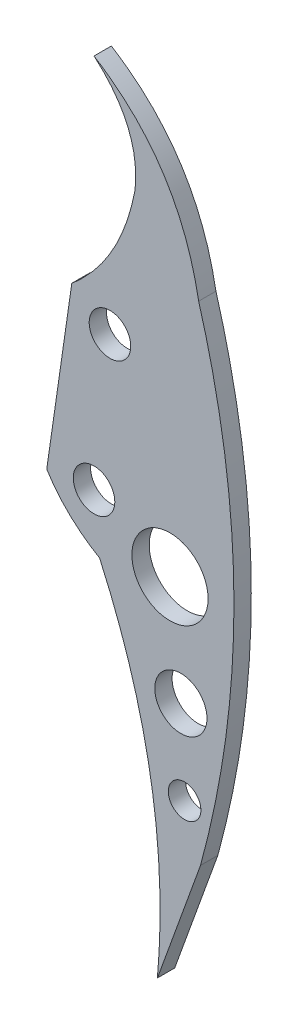
ISO-10303-21;
HEADER;
FILE_DESCRIPTION(('STEP AP214'),'2;1');
FILE_NAME('part.step','',(''),(''),'','','');
FILE_SCHEMA(('AUTOMOTIVE_DESIGN { 1 0 10303 214 1 1 1 1 }'));
ENDSEC;
DATA;
#1=APPLICATION_CONTEXT('core data for automotive mechanical design processes');
#2=APPLICATION_PROTOCOL_DEFINITION('international standard','automotive_design',2000,#1);
#3=PRODUCT_CONTEXT('',#1,'mechanical');
#4=PRODUCT('Part','Part','',(#3));
#5=PRODUCT_RELATED_PRODUCT_CATEGORY('part','',(#4));
#6=PRODUCT_DEFINITION_FORMATION('','',#4);
#7=PRODUCT_DEFINITION_CONTEXT('part definition',#1,'design');
#8=PRODUCT_DEFINITION('design','',#6,#7);
#9=PRODUCT_DEFINITION_SHAPE('','',#8);
#10=(LENGTH_UNIT() NAMED_UNIT(*) SI_UNIT(.MILLI.,.METRE.));
#11=(NAMED_UNIT(*) PLANE_ANGLE_UNIT() SI_UNIT($,.RADIAN.));
#12=(NAMED_UNIT(*) SI_UNIT($,.STERADIAN.) SOLID_ANGLE_UNIT());
#13=UNCERTAINTY_MEASURE_WITH_UNIT(LENGTH_MEASURE(1.E-05),#10,'distance_accuracy_value','');
#14=(GEOMETRIC_REPRESENTATION_CONTEXT(3) GLOBAL_UNCERTAINTY_ASSIGNED_CONTEXT((#13)) GLOBAL_UNIT_ASSIGNED_CONTEXT((#10,
#11,#12)) REPRESENTATION_CONTEXT('',''));
#15=CARTESIAN_POINT('',(0.,0.,0.));
#16=DIRECTION('',(0.,0.,1.));
#17=DIRECTION('',(1.,0.,0.));
#18=AXIS2_PLACEMENT_3D('',#15,#16,#17);
#19=CARTESIAN_POINT('',(4.26040149410169,3.44386363208909,0.5));
#20=DIRECTION('',(0.,0.,-1.));
#21=DIRECTION('',(-1.,0.,0.));
#22=AXIS2_PLACEMENT_3D('',#19,#20,#21);
#23=PLANE('',#22);
#24=CARTESIAN_POINT('',(7.58665327210438,-2.05338737659415,0.5));
#25=DIRECTION('',(0.,0.,1.));
#26=DIRECTION('',(1.,0.,0.));
#27=AXIS2_PLACEMENT_3D('',#24,#25,#26);
#28=CIRCLE('',#27,0.470708967630971);
#29=CARTESIAN_POINT('',(8.05736223973535,-2.05338737659415,0.5));
#30=VERTEX_POINT('',#29);
#31=EDGE_CURVE('E236',#30,#30,#28,.T.);
#32=ORIENTED_EDGE('',*,*,#31,.F.);
#33=EDGE_LOOP('',(#32));
#34=FACE_BOUND('',#33,.T.);
#35=CARTESIAN_POINT('',(7.16473135971415,3.33945502014778,0.5));
#36=DIRECTION('',(0.,0.,1.));
#37=DIRECTION('',(1.,0.,0.));
#38=AXIS2_PLACEMENT_3D('',#35,#36,#37);
#39=CIRCLE('',#38,1.10103819846799);
#40=CARTESIAN_POINT('',(8.26576955818214,3.33945502014778,0.5));
#41=VERTEX_POINT('',#40);
#42=EDGE_CURVE('E248',#41,#41,#39,.T.);
#43=ORIENTED_EDGE('',*,*,#42,.F.);
#44=EDGE_LOOP('',(#43));
#45=FACE_BOUND('',#44,.T.);
#46=CARTESIAN_POINT('',(3.60313218487518,4.25312690831982,0.5));
#47=CARTESIAN_POINT('',(3.97023948005947,3.66079298857822,0.5));
#48=CARTESIAN_POINT('',(4.47949126384359,3.1741092066793,0.5));
#49=CARTESIAN_POINT('',(5.13088753622919,2.79307556262036,0.5));
#50=B_SPLINE_CURVE_WITH_KNOTS('',3,(#46,#47,#48,#49),.UNSPECIFIED.,.F.,.F.,(4,4),
(0.419081868934231,1.),.UNSPECIFIED.);
#51=CARTESIAN_POINT('',(3.60313218487518,4.25312690831982,0.5));
#52=VERTEX_POINT('',#51);
#53=CARTESIAN_POINT('',(5.13088753622919,2.79307556262036,0.5));
#54=VERTEX_POINT('',#53);
#55=EDGE_CURVE('E175',#52,#54,#50,.T.);
#56=ORIENTED_EDGE('',*,*,#55,.T.);
#57=CARTESIAN_POINT('',(5.13088753622919,2.79307556262036,0.5));
#58=CARTESIAN_POINT('',(7.24661574009715,-1.87635654849192,0.5));
#59=CARTESIAN_POINT('',(6.80129128373028,-6.88293102748307,0.5));
#60=B_SPLINE_CURVE_WITH_KNOTS('',2,(#57,#58,#59),.UNSPECIFIED.,.F.,.F.,(3,3),(0.,1.),.UNSPECIFIED.);
#61=CARTESIAN_POINT('',(6.80129128373028,-6.88293102748307,0.5));
#62=VERTEX_POINT('',#61);
#63=EDGE_CURVE('E95',#54,#62,#60,.T.);
#64=ORIENTED_EDGE('',*,*,#63,.T.);
#65=DIRECTION('',(0.340474896632759,0.940253606620529,0.));
#66=VECTOR('',#65,1.);
#67=CARTESIAN_POINT('',(6.80129128373028,-6.88293102748307,0.5));
#68=LINE('',#67,#66);
#69=CARTESIAN_POINT('',(8.04747912795223,-3.44146551374153,0.5));
#70=VERTEX_POINT('',#69);
#71=EDGE_CURVE('E167',#62,#70,#68,.T.);
#72=ORIENTED_EDGE('',*,*,#71,.T.);
#73=CARTESIAN_POINT('',(8.04747912795223,-3.44146551374153,0.5));
#74=CARTESIAN_POINT('',(10.0065167578389,3.73495855960539,0.5));
#75=CARTESIAN_POINT('',(7.99328987446581,10.6518082381875,0.5));
#76=B_SPLINE_CURVE_WITH_KNOTS('',2,(#73,#74,#75),.UNSPECIFIED.,.F.,.F.,(3,3),(0.,1.),.UNSPECIFIED.);
#77=CARTESIAN_POINT('',(7.99328987446581,10.6518082381875,0.5));
#78=VERTEX_POINT('',#77);
#79=EDGE_CURVE('E159',#70,#78,#76,.T.);
#80=ORIENTED_EDGE('',*,*,#79,.T.);
#81=CARTESIAN_POINT('',(7.99328987446581,10.6518082381875,0.5));
#82=CARTESIAN_POINT('',(7.43753052556118,13.7422550617277,0.5));
#83=CARTESIAN_POINT('',(4.9699780842058,15.276811925913,0.5));
#84=B_SPLINE_CURVE_WITH_KNOTS('',2,(#81,#82,#83),.UNSPECIFIED.,.F.,.F.,(3,3),(0.,1.),.UNSPECIFIED.);
#85=CARTESIAN_POINT('',(4.9699780842058,15.276811925913,0.5));
#86=VERTEX_POINT('',#85);
#87=EDGE_CURVE('E114',#78,#86,#84,.T.);
#88=ORIENTED_EDGE('',*,*,#87,.T.);
#89=CARTESIAN_POINT('',(4.9699780842058,15.276811925913,0.5));
#90=CARTESIAN_POINT('',(6.33685516898763,14.0938298971058,0.5));
#91=CARTESIAN_POINT('',(6.15110273487609,12.4939953777772,0.5));
#92=B_SPLINE_CURVE_WITH_KNOTS('',2,(#89,#90,#91),.UNSPECIFIED.,.F.,.F.,(3,3),(0.,1.),.UNSPECIFIED.);
#93=CARTESIAN_POINT('',(6.15110273487609,12.4939953777772,0.5));
#94=VERTEX_POINT('',#93);
#95=EDGE_CURVE('E108',#86,#94,#92,.T.);
#96=ORIENTED_EDGE('',*,*,#95,.T.);
#97=CARTESIAN_POINT('',(6.15110273487609,12.4939953777772,0.5));
#98=CARTESIAN_POINT('',(5.89339429983747,11.1522143834041,0.5));
#99=CARTESIAN_POINT('',(5.2856117889953,10.0769564301717,0.5));
#100=CARTESIAN_POINT('',(4.32775520234913,9.26822151807976,0.5));
#101=B_SPLINE_CURVE_WITH_KNOTS('',3,(#97,#98,#99,#100),.UNSPECIFIED.,.F.,.F.,(4,4),(0.,
0.717084893262547),.UNSPECIFIED.);
#102=CARTESIAN_POINT('',(4.32775520234913,9.26822151807976,0.5));
#103=VERTEX_POINT('',#102);
#104=EDGE_CURVE('E112',#94,#103,#101,.T.);
#105=ORIENTED_EDGE('',*,*,#104,.T.);
#106=DIRECTION('',(-0.14300338133974,-0.989722199874996,0.));
#107=VECTOR('',#106,1.);
#108=CARTESIAN_POINT('',(4.32775520234913,9.26822151807976,0.5));
#109=LINE('',#108,#107);
#110=EDGE_CURVE('E52',#103,#52,#109,.T.);
#111=ORIENTED_EDGE('',*,*,#110,.T.);
#112=EDGE_LOOP('',(#56,#64,#72,#80,#88,#96,#105,#111));
#113=FACE_BOUND('',#112,.T.);
#114=CARTESIAN_POINT('',(5.43038474953858,8.5394702713783,0.5));
#115=DIRECTION('',(0.,0.,1.));
#116=DIRECTION('',(1.,0.,0.));
#117=AXIS2_PLACEMENT_3D('',#114,#115,#116);
#118=CIRCLE('',#117,0.6);
#119=CARTESIAN_POINT('',(6.03038474953858,8.5394702713783,0.5));
#120=VERTEX_POINT('',#119);
#121=EDGE_CURVE('E254',#120,#120,#118,.T.);
#122=ORIENTED_EDGE('',*,*,#121,.F.);
#123=EDGE_LOOP('',(#122));
#124=FACE_BOUND('',#123,.T.);
#125=CARTESIAN_POINT('',(7.47952090992718,0.328032681802716,0.5));
#126=DIRECTION('',(0.,0.,1.));
#127=DIRECTION('',(1.,0.,0.));
#128=AXIS2_PLACEMENT_3D('',#125,#126,#127);
#129=CIRCLE('',#128,0.753706931307007);
#130=CARTESIAN_POINT('',(8.23322784123418,0.328032681802716,0.5));
#131=VERTEX_POINT('',#130);
#132=EDGE_CURVE('E242',#131,#131,#129,.T.);
#133=ORIENTED_EDGE('',*,*,#132,.F.);
#134=EDGE_LOOP('',(#133));
#135=FACE_BOUND('',#134,.T.);
#136=CARTESIAN_POINT('',(4.9699780842058,4.41697175399938,0.5));
#137=DIRECTION('',(0.,0.,1.));
#138=DIRECTION('',(1.,0.,0.));
#139=AXIS2_PLACEMENT_3D('',#136,#137,#138);
#140=CIRCLE('',#139,0.6);
#141=CARTESIAN_POINT('',(5.5699780842058,4.41697175399938,0.5));
#142=VERTEX_POINT('',#141);
#143=EDGE_CURVE('E227',#142,#142,#140,.T.);
#144=ORIENTED_EDGE('',*,*,#143,.F.);
#145=EDGE_LOOP('',(#144));
#146=FACE_BOUND('',#145,.T.);
#147=ADVANCED_FACE('F34',(#34,#45,#113,#124,#135,#146),#23,.F.);
#148=CARTESIAN_POINT('',(4.26040149410169,3.44386363208909,0.));
#149=DIRECTION('',(0.,0.,-1.));
#150=DIRECTION('',(-1.,0.,0.));
#151=AXIS2_PLACEMENT_3D('',#148,#149,#150);
#152=PLANE('',#151);
#153=CARTESIAN_POINT('',(7.58665327210438,-2.05338737659415,0.));
#154=DIRECTION('',(0.,0.,1.));
#155=DIRECTION('',(1.,0.,0.));
#156=AXIS2_PLACEMENT_3D('',#153,#154,#155);
#157=CIRCLE('',#156,0.470708967630971);
#158=CARTESIAN_POINT('',(8.05736223973535,-2.05338737659415,0.));
#159=VERTEX_POINT('',#158);
#160=EDGE_CURVE('E233',#159,#159,#157,.T.);
#161=ORIENTED_EDGE('',*,*,#160,.T.);
#162=EDGE_LOOP('',(#161));
#163=FACE_BOUND('',#162,.T.);
#164=CARTESIAN_POINT('',(7.16473135971415,3.33945502014778,0.));
#165=DIRECTION('',(0.,0.,1.));
#166=DIRECTION('',(1.,0.,0.));
#167=AXIS2_PLACEMENT_3D('',#164,#165,#166);
#168=CIRCLE('',#167,1.10103819846799);
#169=CARTESIAN_POINT('',(8.26576955818214,3.33945502014778,0.));
#170=VERTEX_POINT('',#169);
#171=EDGE_CURVE('E245',#170,#170,#168,.T.);
#172=ORIENTED_EDGE('',*,*,#171,.T.);
#173=EDGE_LOOP('',(#172));
#174=FACE_BOUND('',#173,.T.);
#175=CARTESIAN_POINT('',(3.60313218487518,4.25312690831982,0.));
#176=CARTESIAN_POINT('',(3.97023948005947,3.66079298857822,0.));
#177=CARTESIAN_POINT('',(4.47949126384359,3.1741092066793,0.));
#178=CARTESIAN_POINT('',(5.13088753622919,2.79307556262036,0.));
#179=B_SPLINE_CURVE_WITH_KNOTS('',3,(#175,#176,#177,#178),.UNSPECIFIED.,.F.,.F.,(4,4),
(0.419081868934231,1.),.UNSPECIFIED.);
#180=CARTESIAN_POINT('',(3.60313218487518,4.25312690831982,0.));
#181=VERTEX_POINT('',#180);
#182=CARTESIAN_POINT('',(5.13088753622919,2.79307556262036,0.));
#183=VERTEX_POINT('',#182);
#184=EDGE_CURVE('E256',#181,#183,#179,.T.);
#185=ORIENTED_EDGE('',*,*,#184,.F.);
#186=DIRECTION('',(-0.14300338133974,-0.989722199874996,0.));
#187=VECTOR('',#186,1.);
#188=CARTESIAN_POINT('',(4.32775520234913,9.26822151807976,0.));
#189=LINE('',#188,#187);
#190=CARTESIAN_POINT('',(4.32775520234913,9.26822151807976,0.));
#191=VERTEX_POINT('',#190);
#192=EDGE_CURVE('E87',#191,#181,#189,.T.);
#193=ORIENTED_EDGE('',*,*,#192,.F.);
#194=CARTESIAN_POINT('',(6.15110273487609,12.4939953777772,0.));
#195=CARTESIAN_POINT('',(5.89339429983747,11.1522143834041,0.));
#196=CARTESIAN_POINT('',(5.2856117889953,10.0769564301717,0.));
#197=CARTESIAN_POINT('',(4.32775520234913,9.26822151807976,0.));
#198=B_SPLINE_CURVE_WITH_KNOTS('',3,(#194,#195,#196,#197),.UNSPECIFIED.,.F.,.F.,(4,4),(0.,
0.717084893262547),.UNSPECIFIED.);
#199=CARTESIAN_POINT('',(6.15110273487609,12.4939953777772,0.));
#200=VERTEX_POINT('',#199);
#201=EDGE_CURVE('E81',#200,#191,#198,.T.);
#202=ORIENTED_EDGE('',*,*,#201,.F.);
#203=CARTESIAN_POINT('',(4.9699780842058,15.276811925913,0.));
#204=CARTESIAN_POINT('',(6.33685516898763,14.0938298971058,0.));
#205=CARTESIAN_POINT('',(6.15110273487609,12.4939953777772,0.));
#206=B_SPLINE_CURVE_WITH_KNOTS('',2,(#203,#204,#205),.UNSPECIFIED.,.F.,.F.,(3,3),(0.,1.),.UNSPECIFIED.);
#207=CARTESIAN_POINT('',(4.9699780842058,15.276811925913,0.));
#208=VERTEX_POINT('',#207);
#209=EDGE_CURVE('E122',#208,#200,#206,.T.);
#210=ORIENTED_EDGE('',*,*,#209,.F.);
#211=CARTESIAN_POINT('',(7.99328987446581,10.6518082381875,0.));
#212=CARTESIAN_POINT('',(7.43753052556118,13.7422550617277,0.));
#213=CARTESIAN_POINT('',(4.9699780842058,15.276811925913,0.));
#214=B_SPLINE_CURVE_WITH_KNOTS('',2,(#211,#212,#213),.UNSPECIFIED.,.F.,.F.,(3,3),(0.,1.),.UNSPECIFIED.);
#215=CARTESIAN_POINT('',(7.99328987446581,10.6518082381875,0.));
#216=VERTEX_POINT('',#215);
#217=EDGE_CURVE('E288',#216,#208,#214,.T.);
#218=ORIENTED_EDGE('',*,*,#217,.F.);
#219=CARTESIAN_POINT('',(8.04747912795223,-3.44146551374153,0.));
#220=CARTESIAN_POINT('',(10.0065167578389,3.73495855960539,0.));
#221=CARTESIAN_POINT('',(7.99328987446581,10.6518082381875,0.));
#222=B_SPLINE_CURVE_WITH_KNOTS('',2,(#219,#220,#221),.UNSPECIFIED.,.F.,.F.,(3,3),(0.,1.),.UNSPECIFIED.);
#223=CARTESIAN_POINT('',(8.04747912795223,-3.44146551374153,0.));
#224=VERTEX_POINT('',#223);
#225=EDGE_CURVE('E284',#224,#216,#222,.T.);
#226=ORIENTED_EDGE('',*,*,#225,.F.);
#227=DIRECTION('',(0.340474896632759,0.940253606620529,0.));
#228=VECTOR('',#227,1.);
#229=CARTESIAN_POINT('',(6.80129128373028,-6.88293102748307,0.));
#230=LINE('',#229,#228);
#231=CARTESIAN_POINT('',(6.80129128373028,-6.88293102748307,0.));
#232=VERTEX_POINT('',#231);
#233=EDGE_CURVE('E270',#232,#224,#230,.T.);
#234=ORIENTED_EDGE('',*,*,#233,.F.);
#235=CARTESIAN_POINT('',(5.13088753622919,2.79307556262036,0.));
#236=CARTESIAN_POINT('',(7.24661574009715,-1.87635654849192,0.));
#237=CARTESIAN_POINT('',(6.80129128373028,-6.88293102748307,0.));
#238=B_SPLINE_CURVE_WITH_KNOTS('',2,(#235,#236,#237),.UNSPECIFIED.,.F.,.F.,(3,3),(0.,1.),.UNSPECIFIED.);
#239=EDGE_CURVE('E266',#183,#232,#238,.T.);
#240=ORIENTED_EDGE('',*,*,#239,.F.);
#241=EDGE_LOOP('',(#185,#193,#202,#210,#218,#226,#234,#240));
#242=FACE_BOUND('',#241,.T.);
#243=CARTESIAN_POINT('',(5.43038474953858,8.5394702713783,0.));
#244=DIRECTION('',(0.,0.,1.));
#245=DIRECTION('',(1.,0.,0.));
#246=AXIS2_PLACEMENT_3D('',#243,#244,#245);
#247=CIRCLE('',#246,0.6);
#248=CARTESIAN_POINT('',(6.03038474953858,8.5394702713783,0.));
#249=VERTEX_POINT('',#248);
#250=EDGE_CURVE('E251',#249,#249,#247,.T.);
#251=ORIENTED_EDGE('',*,*,#250,.T.);
#252=EDGE_LOOP('',(#251));
#253=FACE_BOUND('',#252,.T.);
#254=CARTESIAN_POINT('',(7.47952090992718,0.328032681802716,0.));
#255=DIRECTION('',(0.,0.,1.));
#256=DIRECTION('',(1.,0.,0.));
#257=AXIS2_PLACEMENT_3D('',#254,#255,#256);
#258=CIRCLE('',#257,0.753706931307007);
#259=CARTESIAN_POINT('',(8.23322784123418,0.328032681802716,0.));
#260=VERTEX_POINT('',#259);
#261=EDGE_CURVE('E239',#260,#260,#258,.T.);
#262=ORIENTED_EDGE('',*,*,#261,.T.);
#263=EDGE_LOOP('',(#262));
#264=FACE_BOUND('',#263,.T.);
#265=CARTESIAN_POINT('',(4.9699780842058,4.41697175399938,0.));
#266=DIRECTION('',(0.,0.,1.));
#267=DIRECTION('',(1.,0.,0.));
#268=AXIS2_PLACEMENT_3D('',#265,#266,#267);
#269=CIRCLE('',#268,0.6);
#270=CARTESIAN_POINT('',(5.5699780842058,4.41697175399938,0.));
#271=VERTEX_POINT('',#270);
#272=EDGE_CURVE('E230',#271,#271,#269,.T.);
#273=ORIENTED_EDGE('',*,*,#272,.T.);
#274=EDGE_LOOP('',(#273));
#275=FACE_BOUND('',#274,.T.);
#276=ADVANCED_FACE('F193',(#163,#174,#242,#253,#264,#275),#152,.T.);
#277=DIRECTION('',(0.,0.,-1.));
#278=VECTOR('',#277,1.);
#279=SURFACE_OF_LINEAR_EXTRUSION('',#50,#278);
#280=ORIENTED_EDGE('',*,*,#184,.T.);
#281=DIRECTION('',(0.,0.,-1.));
#282=VECTOR('',#281,1.);
#283=CARTESIAN_POINT('',(5.13088753622919,2.79307556262036,0.5));
#284=LINE('',#283,#282);
#285=EDGE_CURVE('E11',#54,#183,#284,.T.);
#286=ORIENTED_EDGE('',*,*,#285,.F.);
#287=ORIENTED_EDGE('',*,*,#55,.F.);
#288=DIRECTION('',(0.,0.,-1.));
#289=VECTOR('',#288,1.);
#290=CARTESIAN_POINT('',(3.60313218487518,4.25312690831982,0.5));
#291=LINE('',#290,#289);
#292=EDGE_CURVE('E128',#52,#181,#291,.T.);
#293=ORIENTED_EDGE('',*,*,#292,.T.);
#294=EDGE_LOOP('',(#280,#286,#287,#293));
#295=FACE_BOUND('',#294,.T.);
#296=ADVANCED_FACE('F36',(#295),#279,.F.);
#297=DIRECTION('',(0.,0.,-1.));
#298=VECTOR('',#297,1.);
#299=SURFACE_OF_LINEAR_EXTRUSION('',#60,#298);
#300=ORIENTED_EDGE('',*,*,#239,.T.);
#301=DIRECTION('',(0.,0.,-1.));
#302=VECTOR('',#301,1.);
#303=CARTESIAN_POINT('',(6.80129128373028,-6.88293102748307,0.5));
#304=LINE('',#303,#302);
#305=EDGE_CURVE('E44',#62,#232,#304,.T.);
#306=ORIENTED_EDGE('',*,*,#305,.F.);
#307=ORIENTED_EDGE('',*,*,#63,.F.);
#308=ORIENTED_EDGE('',*,*,#285,.T.);
#309=EDGE_LOOP('',(#300,#306,#307,#308));
#310=FACE_BOUND('',#309,.T.);
#311=ADVANCED_FACE('F183',(#310),#299,.F.);
#312=CARTESIAN_POINT('',(6.80129128373028,-6.88293102748307,0.5));
#313=DIRECTION('',(-0.940253606620529,0.340474896632759,0.));
#314=DIRECTION('',(-0.340474896632759,-0.940253606620529,0.));
#315=AXIS2_PLACEMENT_3D('',#312,#313,#314);
#316=PLANE('',#315);
#317=ORIENTED_EDGE('',*,*,#233,.T.);
#318=DIRECTION('',(0.,0.,-1.));
#319=VECTOR('',#318,1.);
#320=CARTESIAN_POINT('',(8.04747912795223,-3.44146551374153,0.5));
#321=LINE('',#320,#319);
#322=EDGE_CURVE('E317',#70,#224,#321,.T.);
#323=ORIENTED_EDGE('',*,*,#322,.F.);
#324=ORIENTED_EDGE('',*,*,#71,.F.);
#325=ORIENTED_EDGE('',*,*,#305,.T.);
#326=EDGE_LOOP('',(#317,#323,#324,#325));
#327=FACE_BOUND('',#326,.T.);
#328=ADVANCED_FACE('F185',(#327),#316,.F.);
#329=DIRECTION('',(0.,0.,-1.));
#330=VECTOR('',#329,1.);
#331=SURFACE_OF_LINEAR_EXTRUSION('',#76,#330);
#332=ORIENTED_EDGE('',*,*,#225,.T.);
#333=DIRECTION('',(0.,0.,-1.));
#334=VECTOR('',#333,1.);
#335=CARTESIAN_POINT('',(7.99328987446581,10.6518082381875,0.5));
#336=LINE('',#335,#334);
#337=EDGE_CURVE('E314',#78,#216,#336,.T.);
#338=ORIENTED_EDGE('',*,*,#337,.F.);
#339=ORIENTED_EDGE('',*,*,#79,.F.);
#340=ORIENTED_EDGE('',*,*,#322,.T.);
#341=EDGE_LOOP('',(#332,#338,#339,#340));
#342=FACE_BOUND('',#341,.T.);
#343=ADVANCED_FACE('F152',(#342),#331,.F.);
#344=DIRECTION('',(0.,0.,-1.));
#345=VECTOR('',#344,1.);
#346=SURFACE_OF_LINEAR_EXTRUSION('',#84,#345);
#347=ORIENTED_EDGE('',*,*,#217,.T.);
#348=DIRECTION('',(0.,0.,-1.));
#349=VECTOR('',#348,1.);
#350=CARTESIAN_POINT('',(4.9699780842058,15.276811925913,0.5));
#351=LINE('',#350,#349);
#352=EDGE_CURVE('E123',#86,#208,#351,.T.);
#353=ORIENTED_EDGE('',*,*,#352,.F.);
#354=ORIENTED_EDGE('',*,*,#87,.F.);
#355=ORIENTED_EDGE('',*,*,#337,.T.);
#356=EDGE_LOOP('',(#347,#353,#354,#355));
#357=FACE_BOUND('',#356,.T.);
#358=ADVANCED_FACE('F149',(#357),#346,.F.);
#359=DIRECTION('',(0.,0.,-1.));
#360=VECTOR('',#359,1.);
#361=SURFACE_OF_LINEAR_EXTRUSION('',#92,#360);
#362=ORIENTED_EDGE('',*,*,#209,.T.);
#363=DIRECTION('',(0.,0.,-1.));
#364=VECTOR('',#363,1.);
#365=CARTESIAN_POINT('',(6.15110273487609,12.4939953777772,0.5));
#366=LINE('',#365,#364);
#367=EDGE_CURVE('E119',#94,#200,#366,.T.);
#368=ORIENTED_EDGE('',*,*,#367,.F.);
#369=ORIENTED_EDGE('',*,*,#95,.F.);
#370=ORIENTED_EDGE('',*,*,#352,.T.);
#371=EDGE_LOOP('',(#362,#368,#369,#370));
#372=FACE_BOUND('',#371,.T.);
#373=ADVANCED_FACE('F120',(#372),#361,.F.);
#374=DIRECTION('',(0.,0.,-1.));
#375=VECTOR('',#374,1.);
#376=SURFACE_OF_LINEAR_EXTRUSION('',#101,#375);
#377=ORIENTED_EDGE('',*,*,#201,.T.);
#378=DIRECTION('',(0.,0.,-1.));
#379=VECTOR('',#378,1.);
#380=CARTESIAN_POINT('',(4.32775520234913,9.26822151807976,0.5));
#381=LINE('',#380,#379);
#382=EDGE_CURVE('E124',#103,#191,#381,.T.);
#383=ORIENTED_EDGE('',*,*,#382,.F.);
#384=ORIENTED_EDGE('',*,*,#104,.F.);
#385=ORIENTED_EDGE('',*,*,#367,.T.);
#386=EDGE_LOOP('',(#377,#383,#384,#385));
#387=FACE_BOUND('',#386,.T.);
#388=ADVANCED_FACE('F126',(#387),#376,.F.);
#389=CARTESIAN_POINT('',(4.32775520234913,9.26822151807976,0.5));
#390=DIRECTION('',(0.989722199874996,-0.14300338133974,0.));
#391=DIRECTION('',(0.14300338133974,0.989722199874996,0.));
#392=AXIS2_PLACEMENT_3D('',#389,#390,#391);
#393=PLANE('',#392);
#394=ORIENTED_EDGE('',*,*,#192,.T.);
#395=ORIENTED_EDGE('',*,*,#292,.F.);
#396=ORIENTED_EDGE('',*,*,#110,.F.);
#397=ORIENTED_EDGE('',*,*,#382,.T.);
#398=EDGE_LOOP('',(#394,#395,#396,#397));
#399=FACE_BOUND('',#398,.T.);
#400=ADVANCED_FACE('F145',(#399),#393,.F.);
#401=CARTESIAN_POINT('',(5.43038474953858,8.5394702713783,0.5));
#402=DIRECTION('',(0.,0.,-1.));
#403=DIRECTION('',(-1.,0.,0.));
#404=AXIS2_PLACEMENT_3D('',#401,#402,#403);
#405=CYLINDRICAL_SURFACE('',#404,0.6);
#406=ORIENTED_EDGE('',*,*,#121,.T.);
#407=EDGE_LOOP('',(#406));
#408=FACE_BOUND('',#407,.T.);
#409=ORIENTED_EDGE('',*,*,#250,.F.);
#410=EDGE_LOOP('',(#409));
#411=FACE_BOUND('',#410,.T.);
#412=ADVANCED_FACE('F203',(#408,#411),#405,.F.);
#413=CARTESIAN_POINT('',(7.16473135971415,3.33945502014778,0.5));
#414=DIRECTION('',(0.,0.,-1.));
#415=DIRECTION('',(-1.,0.,0.));
#416=AXIS2_PLACEMENT_3D('',#413,#414,#415);
#417=CYLINDRICAL_SURFACE('',#416,1.10103819846799);
#418=ORIENTED_EDGE('',*,*,#42,.T.);
#419=EDGE_LOOP('',(#418));
#420=FACE_BOUND('',#419,.T.);
#421=ORIENTED_EDGE('',*,*,#171,.F.);
#422=EDGE_LOOP('',(#421));
#423=FACE_BOUND('',#422,.T.);
#424=ADVANCED_FACE('F206',(#420,#423),#417,.F.);
#425=CARTESIAN_POINT('',(7.47952090992718,0.328032681802716,0.5));
#426=DIRECTION('',(0.,0.,-1.));
#427=DIRECTION('',(-1.,0.,0.));
#428=AXIS2_PLACEMENT_3D('',#425,#426,#427);
#429=CYLINDRICAL_SURFACE('',#428,0.753706931307007);
#430=ORIENTED_EDGE('',*,*,#132,.T.);
#431=EDGE_LOOP('',(#430));
#432=FACE_BOUND('',#431,.T.);
#433=ORIENTED_EDGE('',*,*,#261,.F.);
#434=EDGE_LOOP('',(#433));
#435=FACE_BOUND('',#434,.T.);
#436=ADVANCED_FACE('F210',(#432,#435),#429,.F.);
#437=CARTESIAN_POINT('',(7.58665327210438,-2.05338737659415,0.5));
#438=DIRECTION('',(0.,0.,-1.));
#439=DIRECTION('',(-1.,0.,0.));
#440=AXIS2_PLACEMENT_3D('',#437,#438,#439);
#441=CYLINDRICAL_SURFACE('',#440,0.470708967630971);
#442=ORIENTED_EDGE('',*,*,#31,.T.);
#443=EDGE_LOOP('',(#442));
#444=FACE_BOUND('',#443,.T.);
#445=ORIENTED_EDGE('',*,*,#160,.F.);
#446=EDGE_LOOP('',(#445));
#447=FACE_BOUND('',#446,.T.);
#448=ADVANCED_FACE('F214',(#444,#447),#441,.F.);
#449=CARTESIAN_POINT('',(4.9699780842058,4.41697175399938,0.5));
#450=DIRECTION('',(0.,0.,-1.));
#451=DIRECTION('',(-1.,0.,0.));
#452=AXIS2_PLACEMENT_3D('',#449,#450,#451);
#453=CYLINDRICAL_SURFACE('',#452,0.6);
#454=ORIENTED_EDGE('',*,*,#143,.T.);
#455=EDGE_LOOP('',(#454));
#456=FACE_BOUND('',#455,.T.);
#457=ORIENTED_EDGE('',*,*,#272,.F.);
#458=EDGE_LOOP('',(#457));
#459=FACE_BOUND('',#458,.T.);
#460=ADVANCED_FACE('F218',(#456,#459),#453,.F.);
#461=CLOSED_SHELL('',(#147,#276,#296,#311,#328,#343,#358,#373,#388,#400,#412,#424,#436,#448,#460));
#462=MANIFOLD_SOLID_BREP('B2',#461);
#463=ADVANCED_BREP_SHAPE_REPRESENTATION('',(#18,#462),#14);
#464=SHAPE_DEFINITION_REPRESENTATION(#9,#463);
ENDSEC;
END-ISO-10303-21;
